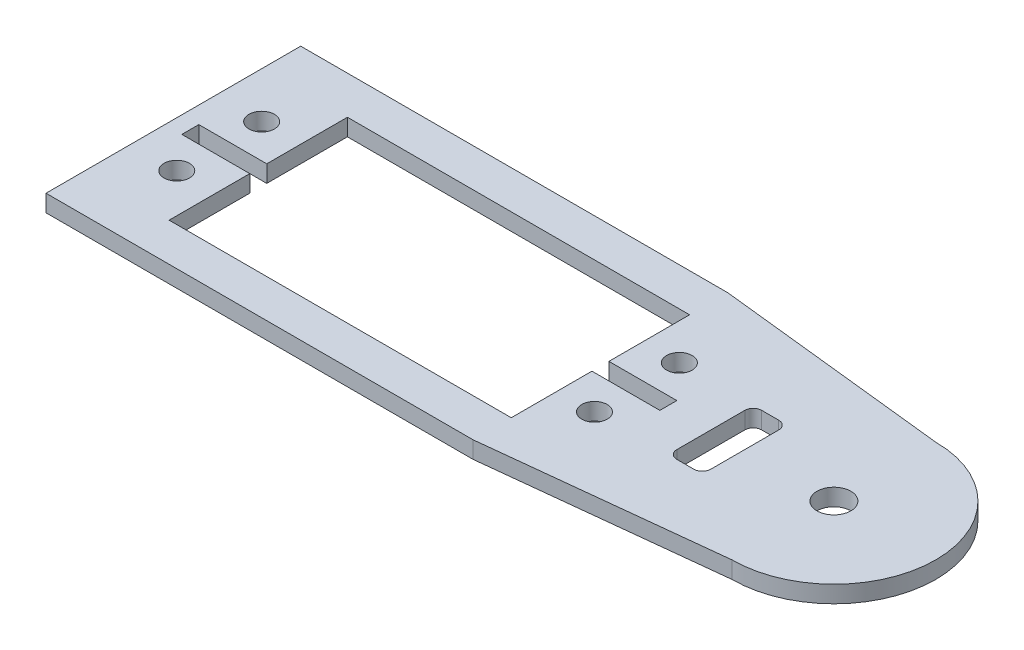
ISO-10303-21;
HEADER;
FILE_DESCRIPTION(('STEP AP214'),'2;1');
FILE_NAME('part.step','',(''),(''),'','','');
FILE_SCHEMA(('AUTOMOTIVE_DESIGN { 1 0 10303 214 1 1 1 1 }'));
ENDSEC;
DATA;
#1=APPLICATION_CONTEXT('core data for automotive mechanical design processes');
#2=APPLICATION_PROTOCOL_DEFINITION('international standard','automotive_design',2000,#1);
#3=PRODUCT_CONTEXT('',#1,'mechanical');
#4=PRODUCT('Part','Part','',(#3));
#5=PRODUCT_RELATED_PRODUCT_CATEGORY('part','',(#4));
#6=PRODUCT_DEFINITION_FORMATION('','',#4);
#7=PRODUCT_DEFINITION_CONTEXT('part definition',#1,'design');
#8=PRODUCT_DEFINITION('design','',#6,#7);
#9=PRODUCT_DEFINITION_SHAPE('','',#8);
#10=(LENGTH_UNIT() NAMED_UNIT(*) SI_UNIT(.MILLI.,.METRE.));
#11=(NAMED_UNIT(*) PLANE_ANGLE_UNIT() SI_UNIT($,.RADIAN.));
#12=(NAMED_UNIT(*) SI_UNIT($,.STERADIAN.) SOLID_ANGLE_UNIT());
#13=UNCERTAINTY_MEASURE_WITH_UNIT(LENGTH_MEASURE(1.E-05),#10,'distance_accuracy_value','');
#14=(GEOMETRIC_REPRESENTATION_CONTEXT(3) GLOBAL_UNCERTAINTY_ASSIGNED_CONTEXT((#13)) GLOBAL_UNIT_ASSIGNED_CONTEXT((#10,
#11,#12)) REPRESENTATION_CONTEXT('',''));
#15=CARTESIAN_POINT('',(0.,0.,0.));
#16=DIRECTION('',(0.,0.,1.));
#17=DIRECTION('',(1.,0.,0.));
#18=AXIS2_PLACEMENT_3D('',#15,#16,#17);
#19=CARTESIAN_POINT('',(75.8,2.,-15.));
#20=DIRECTION('',(0.,1.,0.));
#21=DIRECTION('',(0.,0.,1.));
#22=AXIS2_PLACEMENT_3D('',#19,#20,#21);
#23=PLANE('',#22);
#24=CARTESIAN_POINT('',(52.6,2.,-20.));
#25=DIRECTION('',(0.,1.,0.));
#26=DIRECTION('',(0.,0.,1.));
#27=AXIS2_PLACEMENT_3D('',#24,#25,#26);
#28=CIRCLE('',#27,1.5);
#29=CARTESIAN_POINT('',(52.6,2.,-18.5));
#30=VERTEX_POINT('',#29);
#31=EDGE_CURVE('E428',#30,#30,#28,.T.);
#32=ORIENTED_EDGE('',*,*,#31,.F.);
#33=EDGE_LOOP('',(#32));
#34=FACE_BOUND('',#33,.T.);
#35=CARTESIAN_POINT('',(3.4,2.,-20.));
#36=DIRECTION('',(0.,1.,0.));
#37=DIRECTION('',(0.,0.,1.));
#38=AXIS2_PLACEMENT_3D('',#35,#36,#37);
#39=CIRCLE('',#38,1.5);
#40=CARTESIAN_POINT('',(3.4,2.,-18.5));
#41=VERTEX_POINT('',#40);
#42=EDGE_CURVE('E440',#41,#41,#39,.T.);
#43=ORIENTED_EDGE('',*,*,#42,.F.);
#44=EDGE_LOOP('',(#43));
#45=FACE_BOUND('',#44,.T.);
#46=DIRECTION('',(-1.,0.,0.));
#47=VECTOR('',#46,1.);
#48=CARTESIAN_POINT('',(0.,2.,-16.));
#49=LINE('',#48,#47);
#50=CARTESIAN_POINT('',(8.,2.,-16.));
#51=VERTEX_POINT('',#50);
#52=CARTESIAN_POINT('',(0.,2.,-16.));
#53=VERTEX_POINT('',#52);
#54=EDGE_CURVE('E221',#51,#53,#49,.T.);
#55=ORIENTED_EDGE('',*,*,#54,.F.);
#56=DIRECTION('',(0.,0.,1.));
#57=VECTOR('',#56,1.);
#58=CARTESIAN_POINT('',(8.,2.,-16.));
#59=LINE('',#58,#57);
#60=CARTESIAN_POINT('',(8.,2.,-25.5));
#61=VERTEX_POINT('',#60);
#62=EDGE_CURVE('E211',#61,#51,#59,.T.);
#63=ORIENTED_EDGE('',*,*,#62,.F.);
#64=DIRECTION('',(-1.,0.,0.));
#65=VECTOR('',#64,1.);
#66=CARTESIAN_POINT('',(8.,2.,-25.5));
#67=LINE('',#66,#65);
#68=CARTESIAN_POINT('',(48.3,2.,-25.5));
#69=VERTEX_POINT('',#68);
#70=EDGE_CURVE('E257',#69,#61,#67,.T.);
#71=ORIENTED_EDGE('',*,*,#70,.F.);
#72=DIRECTION('',(0.,0.,-1.));
#73=VECTOR('',#72,1.);
#74=CARTESIAN_POINT('',(48.3,2.,-25.5));
#75=LINE('',#74,#73);
#76=CARTESIAN_POINT('',(48.3,2.,-16.));
#77=VERTEX_POINT('',#76);
#78=EDGE_CURVE('E254',#77,#69,#75,.T.);
#79=ORIENTED_EDGE('',*,*,#78,.F.);
#80=DIRECTION('',(-1.,0.,0.));
#81=VECTOR('',#80,1.);
#82=CARTESIAN_POINT('',(48.3,2.,-16.));
#83=LINE('',#82,#81);
#84=CARTESIAN_POINT('',(56.3,2.,-16.));
#85=VERTEX_POINT('',#84);
#86=EDGE_CURVE('E252',#85,#77,#83,.T.);
#87=ORIENTED_EDGE('',*,*,#86,.F.);
#88=DIRECTION('',(0.,0.,-1.));
#89=VECTOR('',#88,1.);
#90=CARTESIAN_POINT('',(56.3,2.,-14.));
#91=LINE('',#90,#89);
#92=CARTESIAN_POINT('',(56.3,2.,-14.));
#93=VERTEX_POINT('',#92);
#94=EDGE_CURVE('E250',#93,#85,#91,.T.);
#95=ORIENTED_EDGE('',*,*,#94,.F.);
#96=DIRECTION('',(1.,0.,0.));
#97=VECTOR('',#96,1.);
#98=CARTESIAN_POINT('',(48.3,2.,-14.));
#99=LINE('',#98,#97);
#100=CARTESIAN_POINT('',(48.3,2.,-14.));
#101=VERTEX_POINT('',#100);
#102=EDGE_CURVE('E248',#101,#93,#99,.T.);
#103=ORIENTED_EDGE('',*,*,#102,.F.);
#104=DIRECTION('',(0.,0.,-1.));
#105=VECTOR('',#104,1.);
#106=CARTESIAN_POINT('',(48.3,2.,-14.));
#107=LINE('',#106,#105);
#108=CARTESIAN_POINT('',(48.3,2.,-4.5));
#109=VERTEX_POINT('',#108);
#110=EDGE_CURVE('E246',#109,#101,#107,.T.);
#111=ORIENTED_EDGE('',*,*,#110,.F.);
#112=DIRECTION('',(1.,0.,0.));
#113=VECTOR('',#112,1.);
#114=CARTESIAN_POINT('',(8.,2.,-4.5));
#115=LINE('',#114,#113);
#116=CARTESIAN_POINT('',(8.,2.,-4.5));
#117=VERTEX_POINT('',#116);
#118=EDGE_CURVE('E244',#117,#109,#115,.T.);
#119=ORIENTED_EDGE('',*,*,#118,.F.);
#120=DIRECTION('',(0.,0.,1.));
#121=VECTOR('',#120,1.);
#122=CARTESIAN_POINT('',(8.,2.,-4.5));
#123=LINE('',#122,#121);
#124=CARTESIAN_POINT('',(8.,2.,-14.));
#125=VERTEX_POINT('',#124);
#126=EDGE_CURVE('E242',#125,#117,#123,.T.);
#127=ORIENTED_EDGE('',*,*,#126,.F.);
#128=DIRECTION('',(1.,0.,0.));
#129=VECTOR('',#128,1.);
#130=CARTESIAN_POINT('',(0.,2.,-14.));
#131=LINE('',#130,#129);
#132=CARTESIAN_POINT('',(0.,2.,-14.));
#133=VERTEX_POINT('',#132);
#134=EDGE_CURVE('E237',#133,#125,#131,.T.);
#135=ORIENTED_EDGE('',*,*,#134,.F.);
#136=DIRECTION('',(0.,0.,1.));
#137=VECTOR('',#136,1.);
#138=CARTESIAN_POINT('',(0.,2.,-14.));
#139=LINE('',#138,#137);
#140=EDGE_CURVE('E235',#53,#133,#139,.T.);
#141=ORIENTED_EDGE('',*,*,#140,.F.);
#142=EDGE_LOOP('',(#55,#63,#71,#79,#87,#95,#103,#111,#119,#127,#135,#141));
#143=FACE_BOUND('',#142,.T.);
#144=DIRECTION('',(-0.994102176607995,0.,-0.108447510175419));
#145=VECTOR('',#144,1.);
#146=CARTESIAN_POINT('',(48.3,2.,-30.));
#147=LINE('',#146,#145);
#148=CARTESIAN_POINT('',(75.8,2.,-27.));
#149=VERTEX_POINT('',#148);
#150=CARTESIAN_POINT('',(48.3,2.,-30.));
#151=VERTEX_POINT('',#150);
#152=EDGE_CURVE('E312',#149,#151,#147,.T.);
#153=ORIENTED_EDGE('',*,*,#152,.T.);
#154=DIRECTION('',(-1.,0.,0.));
#155=VECTOR('',#154,1.);
#156=CARTESIAN_POINT('',(-2.,2.,-30.));
#157=LINE('',#156,#155);
#158=CARTESIAN_POINT('',(-2.,2.,-30.));
#159=VERTEX_POINT('',#158);
#160=EDGE_CURVE('E315',#151,#159,#157,.T.);
#161=ORIENTED_EDGE('',*,*,#160,.T.);
#162=DIRECTION('',(0.,0.,1.));
#163=VECTOR('',#162,1.);
#164=CARTESIAN_POINT('',(-2.,2.,-30.));
#165=LINE('',#164,#163);
#166=CARTESIAN_POINT('',(-2.,2.,0.));
#167=VERTEX_POINT('',#166);
#168=EDGE_CURVE('E318',#159,#167,#165,.T.);
#169=ORIENTED_EDGE('',*,*,#168,.T.);
#170=DIRECTION('',(1.,0.,0.));
#171=VECTOR('',#170,1.);
#172=CARTESIAN_POINT('',(-2.,2.,0.));
#173=LINE('',#172,#171);
#174=CARTESIAN_POINT('',(48.3,2.,0.));
#175=VERTEX_POINT('',#174);
#176=EDGE_CURVE('E320',#167,#175,#173,.T.);
#177=ORIENTED_EDGE('',*,*,#176,.T.);
#178=DIRECTION('',(0.994102176607995,0.,-0.108447510175417));
#179=VECTOR('',#178,1.);
#180=CARTESIAN_POINT('',(48.3,2.,0.));
#181=LINE('',#180,#179);
#182=CARTESIAN_POINT('',(75.8,2.,-3.00000000000001));
#183=VERTEX_POINT('',#182);
#184=EDGE_CURVE('E322',#175,#183,#181,.T.);
#185=ORIENTED_EDGE('',*,*,#184,.T.);
#186=CARTESIAN_POINT('',(75.8,2.,-15.));
#187=DIRECTION('',(0.,1.,0.));
#188=DIRECTION('',(0.,0.,1.));
#189=AXIS2_PLACEMENT_3D('',#186,#187,#188);
#190=CIRCLE('',#189,12.);
#191=EDGE_CURVE('E324',#183,#149,#190,.T.);
#192=ORIENTED_EDGE('',*,*,#191,.T.);
#193=EDGE_LOOP('',(#153,#161,#169,#177,#185,#192));
#194=FACE_BOUND('',#193,.T.);
#195=CARTESIAN_POINT('',(3.4,2.,-10.));
#196=DIRECTION('',(0.,1.,0.));
#197=DIRECTION('',(0.,0.,1.));
#198=AXIS2_PLACEMENT_3D('',#195,#196,#197);
#199=CIRCLE('',#198,1.5);
#200=CARTESIAN_POINT('',(3.4,2.,-8.5));
#201=VERTEX_POINT('',#200);
#202=EDGE_CURVE('E261',#201,#201,#199,.T.);
#203=ORIENTED_EDGE('',*,*,#202,.F.);
#204=EDGE_LOOP('',(#203));
#205=FACE_BOUND('',#204,.T.);
#206=CARTESIAN_POINT('',(52.6,2.,-10.));
#207=DIRECTION('',(0.,1.,0.));
#208=DIRECTION('',(0.,0.,1.));
#209=AXIS2_PLACEMENT_3D('',#206,#207,#208);
#210=CIRCLE('',#209,1.5);
#211=CARTESIAN_POINT('',(52.6,2.,-8.49999999999999));
#212=VERTEX_POINT('',#211);
#213=EDGE_CURVE('E434',#212,#212,#210,.T.);
#214=ORIENTED_EDGE('',*,*,#213,.F.);
#215=EDGE_LOOP('',(#214));
#216=FACE_BOUND('',#215,.T.);
#217=CARTESIAN_POINT('',(75.8,2.,-15.));
#218=DIRECTION('',(0.,1.,0.));
#219=DIRECTION('',(0.,0.,1.));
#220=AXIS2_PLACEMENT_3D('',#217,#218,#219);
#221=CIRCLE('',#220,2.);
#222=CARTESIAN_POINT('',(75.8,2.,-13.));
#223=VERTEX_POINT('',#222);
#224=EDGE_CURVE('E422',#223,#223,#221,.T.);
#225=ORIENTED_EDGE('',*,*,#224,.F.);
#226=EDGE_LOOP('',(#225));
#227=FACE_BOUND('',#226,.T.);
#228=DIRECTION('',(-1.,0.,0.));
#229=VECTOR('',#228,1.);
#230=CARTESIAN_POINT('',(65.3,2.,-20.));
#231=LINE('',#230,#229);
#232=CARTESIAN_POINT('',(64.3,2.,-20.));
#233=VERTEX_POINT('',#232);
#234=CARTESIAN_POINT('',(62.3,2.,-20.));
#235=VERTEX_POINT('',#234);
#236=EDGE_CURVE('E403',#233,#235,#231,.T.);
#237=ORIENTED_EDGE('',*,*,#236,.F.);
#238=CARTESIAN_POINT('',(64.3,2.,-19.));
#239=DIRECTION('',(0.,1.,0.));
#240=DIRECTION('',(0.,0.,1.));
#241=AXIS2_PLACEMENT_3D('',#238,#239,#240);
#242=CIRCLE('',#241,1.);
#243=CARTESIAN_POINT('',(65.3,2.,-19.));
#244=VERTEX_POINT('',#243);
#245=EDGE_CURVE('E11',#233,#244,#242,.F.);
#246=ORIENTED_EDGE('',*,*,#245,.T.);
#247=DIRECTION('',(0.,0.,-1.));
#248=VECTOR('',#247,1.);
#249=CARTESIAN_POINT('',(65.3,2.,-20.));
#250=LINE('',#249,#248);
#251=CARTESIAN_POINT('',(65.3,2.,-11.));
#252=VERTEX_POINT('',#251);
#253=EDGE_CURVE('E401',#252,#244,#250,.T.);
#254=ORIENTED_EDGE('',*,*,#253,.F.);
#255=CARTESIAN_POINT('',(64.3,2.,-11.));
#256=DIRECTION('',(0.,1.,0.));
#257=DIRECTION('',(0.,0.,1.));
#258=AXIS2_PLACEMENT_3D('',#255,#256,#257);
#259=CIRCLE('',#258,1.);
#260=CARTESIAN_POINT('',(64.3,2.,-10.));
#261=VERTEX_POINT('',#260);
#262=EDGE_CURVE('E380',#252,#261,#259,.F.);
#263=ORIENTED_EDGE('',*,*,#262,.T.);
#264=DIRECTION('',(1.,0.,0.));
#265=VECTOR('',#264,1.);
#266=CARTESIAN_POINT('',(65.3,2.,-10.));
#267=LINE('',#266,#265);
#268=CARTESIAN_POINT('',(62.3,2.,-10.));
#269=VERTEX_POINT('',#268);
#270=EDGE_CURVE('E415',#269,#261,#267,.T.);
#271=ORIENTED_EDGE('',*,*,#270,.F.);
#272=CARTESIAN_POINT('',(62.3,2.,-11.));
#273=DIRECTION('',(0.,1.,0.));
#274=DIRECTION('',(0.,0.,1.));
#275=AXIS2_PLACEMENT_3D('',#272,#273,#274);
#276=CIRCLE('',#275,1.);
#277=CARTESIAN_POINT('',(61.3,2.,-11.));
#278=VERTEX_POINT('',#277);
#279=EDGE_CURVE('E376',#269,#278,#276,.F.);
#280=ORIENTED_EDGE('',*,*,#279,.T.);
#281=DIRECTION('',(0.,0.,1.));
#282=VECTOR('',#281,1.);
#283=CARTESIAN_POINT('',(61.3,2.,-20.));
#284=LINE('',#283,#282);
#285=CARTESIAN_POINT('',(61.3,2.,-19.));
#286=VERTEX_POINT('',#285);
#287=EDGE_CURVE('E409',#286,#278,#284,.T.);
#288=ORIENTED_EDGE('',*,*,#287,.F.);
#289=CARTESIAN_POINT('',(62.3,2.,-19.));
#290=DIRECTION('',(0.,1.,0.));
#291=DIRECTION('',(0.,0.,1.));
#292=AXIS2_PLACEMENT_3D('',#289,#290,#291);
#293=CIRCLE('',#292,1.);
#294=EDGE_CURVE('E51',#286,#235,#293,.F.);
#295=ORIENTED_EDGE('',*,*,#294,.T.);
#296=EDGE_LOOP('',(#237,#246,#254,#263,#271,#280,#288,#295));
#297=FACE_BOUND('',#296,.T.);
#298=ADVANCED_FACE('F36',(#34,#45,#143,#194,#205,#216,#227,#297),#23,.T.);
#299=CARTESIAN_POINT('',(75.8,0.,-15.));
#300=DIRECTION('',(0.,1.,0.));
#301=DIRECTION('',(0.,0.,1.));
#302=AXIS2_PLACEMENT_3D('',#299,#300,#301);
#303=PLANE('',#302);
#304=CARTESIAN_POINT('',(75.8,0.,-15.));
#305=DIRECTION('',(0.,1.,0.));
#306=DIRECTION('',(0.,0.,1.));
#307=AXIS2_PLACEMENT_3D('',#304,#305,#306);
#308=CIRCLE('',#307,2.);
#309=CARTESIAN_POINT('',(75.8,0.,-13.));
#310=VERTEX_POINT('',#309);
#311=EDGE_CURVE('E418',#310,#310,#308,.T.);
#312=ORIENTED_EDGE('',*,*,#311,.T.);
#313=EDGE_LOOP('',(#312));
#314=FACE_BOUND('',#313,.T.);
#315=CARTESIAN_POINT('',(52.6,0.,-20.));
#316=DIRECTION('',(0.,1.,0.));
#317=DIRECTION('',(0.,0.,1.));
#318=AXIS2_PLACEMENT_3D('',#315,#316,#317);
#319=CIRCLE('',#318,1.5);
#320=CARTESIAN_POINT('',(52.6,0.,-18.5));
#321=VERTEX_POINT('',#320);
#322=EDGE_CURVE('E425',#321,#321,#319,.T.);
#323=ORIENTED_EDGE('',*,*,#322,.T.);
#324=EDGE_LOOP('',(#323));
#325=FACE_BOUND('',#324,.T.);
#326=CARTESIAN_POINT('',(52.6,0.,-10.));
#327=DIRECTION('',(0.,1.,0.));
#328=DIRECTION('',(0.,0.,1.));
#329=AXIS2_PLACEMENT_3D('',#326,#327,#328);
#330=CIRCLE('',#329,1.5);
#331=CARTESIAN_POINT('',(52.6,0.,-8.49999999999999));
#332=VERTEX_POINT('',#331);
#333=EDGE_CURVE('E431',#332,#332,#330,.T.);
#334=ORIENTED_EDGE('',*,*,#333,.T.);
#335=EDGE_LOOP('',(#334));
#336=FACE_BOUND('',#335,.T.);
#337=CARTESIAN_POINT('',(3.4,0.,-20.));
#338=DIRECTION('',(0.,1.,0.));
#339=DIRECTION('',(0.,0.,1.));
#340=AXIS2_PLACEMENT_3D('',#337,#338,#339);
#341=CIRCLE('',#340,1.5);
#342=CARTESIAN_POINT('',(3.4,0.,-18.5));
#343=VERTEX_POINT('',#342);
#344=EDGE_CURVE('E437',#343,#343,#341,.T.);
#345=ORIENTED_EDGE('',*,*,#344,.T.);
#346=EDGE_LOOP('',(#345));
#347=FACE_BOUND('',#346,.T.);
#348=CARTESIAN_POINT('',(3.4,0.,-10.));
#349=DIRECTION('',(0.,1.,0.));
#350=DIRECTION('',(0.,0.,1.));
#351=AXIS2_PLACEMENT_3D('',#348,#349,#350);
#352=CIRCLE('',#351,1.5);
#353=CARTESIAN_POINT('',(3.4,0.,-8.5));
#354=VERTEX_POINT('',#353);
#355=EDGE_CURVE('E443',#354,#354,#352,.T.);
#356=ORIENTED_EDGE('',*,*,#355,.T.);
#357=EDGE_LOOP('',(#356));
#358=FACE_BOUND('',#357,.T.);
#359=DIRECTION('',(0.,0.,1.));
#360=VECTOR('',#359,1.);
#361=CARTESIAN_POINT('',(8.,0.,-16.));
#362=LINE('',#361,#360);
#363=CARTESIAN_POINT('',(8.00000000000001,0.,-25.5));
#364=VERTEX_POINT('',#363);
#365=CARTESIAN_POINT('',(8.,0.,-16.));
#366=VERTEX_POINT('',#365);
#367=EDGE_CURVE('E259',#364,#366,#362,.T.);
#368=ORIENTED_EDGE('',*,*,#367,.T.);
#369=DIRECTION('',(-1.,0.,0.));
#370=VECTOR('',#369,1.);
#371=CARTESIAN_POINT('',(0.,0.,-16.));
#372=LINE('',#371,#370);
#373=CARTESIAN_POINT('',(0.,0.,-16.));
#374=VERTEX_POINT('',#373);
#375=EDGE_CURVE('E228',#366,#374,#372,.T.);
#376=ORIENTED_EDGE('',*,*,#375,.T.);
#377=DIRECTION('',(0.,0.,1.));
#378=VECTOR('',#377,1.);
#379=CARTESIAN_POINT('',(0.,0.,-14.));
#380=LINE('',#379,#378);
#381=CARTESIAN_POINT('',(0.,0.,-14.));
#382=VERTEX_POINT('',#381);
#383=EDGE_CURVE('E263',#374,#382,#380,.T.);
#384=ORIENTED_EDGE('',*,*,#383,.T.);
#385=DIRECTION('',(1.,0.,0.));
#386=VECTOR('',#385,1.);
#387=CARTESIAN_POINT('',(0.,0.,-14.));
#388=LINE('',#387,#386);
#389=CARTESIAN_POINT('',(8.,0.,-14.));
#390=VERTEX_POINT('',#389);
#391=EDGE_CURVE('E266',#382,#390,#388,.T.);
#392=ORIENTED_EDGE('',*,*,#391,.T.);
#393=DIRECTION('',(0.,0.,1.));
#394=VECTOR('',#393,1.);
#395=CARTESIAN_POINT('',(8.,0.,-4.5));
#396=LINE('',#395,#394);
#397=CARTESIAN_POINT('',(8.,0.,-4.5));
#398=VERTEX_POINT('',#397);
#399=EDGE_CURVE('E269',#390,#398,#396,.T.);
#400=ORIENTED_EDGE('',*,*,#399,.T.);
#401=DIRECTION('',(1.,0.,0.));
#402=VECTOR('',#401,1.);
#403=CARTESIAN_POINT('',(8.,0.,-4.5));
#404=LINE('',#403,#402);
#405=CARTESIAN_POINT('',(48.3,0.,-4.5));
#406=VERTEX_POINT('',#405);
#407=EDGE_CURVE('E272',#398,#406,#404,.T.);
#408=ORIENTED_EDGE('',*,*,#407,.T.);
#409=DIRECTION('',(0.,0.,-1.));
#410=VECTOR('',#409,1.);
#411=CARTESIAN_POINT('',(48.3,0.,-14.));
#412=LINE('',#411,#410);
#413=CARTESIAN_POINT('',(48.3,0.,-14.));
#414=VERTEX_POINT('',#413);
#415=EDGE_CURVE('E275',#406,#414,#412,.T.);
#416=ORIENTED_EDGE('',*,*,#415,.T.);
#417=DIRECTION('',(1.,0.,0.));
#418=VECTOR('',#417,1.);
#419=CARTESIAN_POINT('',(48.3,0.,-14.));
#420=LINE('',#419,#418);
#421=CARTESIAN_POINT('',(56.3,0.,-14.));
#422=VERTEX_POINT('',#421);
#423=EDGE_CURVE('E278',#414,#422,#420,.T.);
#424=ORIENTED_EDGE('',*,*,#423,.T.);
#425=DIRECTION('',(0.,0.,-1.));
#426=VECTOR('',#425,1.);
#427=CARTESIAN_POINT('',(56.3,0.,-14.));
#428=LINE('',#427,#426);
#429=CARTESIAN_POINT('',(56.3,0.,-16.));
#430=VERTEX_POINT('',#429);
#431=EDGE_CURVE('E281',#422,#430,#428,.T.);
#432=ORIENTED_EDGE('',*,*,#431,.T.);
#433=DIRECTION('',(-1.,0.,0.));
#434=VECTOR('',#433,1.);
#435=CARTESIAN_POINT('',(48.3,0.,-16.));
#436=LINE('',#435,#434);
#437=CARTESIAN_POINT('',(48.3,0.,-16.));
#438=VERTEX_POINT('',#437);
#439=EDGE_CURVE('E284',#430,#438,#436,.T.);
#440=ORIENTED_EDGE('',*,*,#439,.T.);
#441=DIRECTION('',(0.,0.,-1.));
#442=VECTOR('',#441,1.);
#443=CARTESIAN_POINT('',(48.3,0.,-25.5));
#444=LINE('',#443,#442);
#445=CARTESIAN_POINT('',(48.3,0.,-25.5));
#446=VERTEX_POINT('',#445);
#447=EDGE_CURVE('E287',#438,#446,#444,.T.);
#448=ORIENTED_EDGE('',*,*,#447,.T.);
#449=DIRECTION('',(-1.,0.,0.));
#450=VECTOR('',#449,1.);
#451=CARTESIAN_POINT('',(8.,0.,-25.5));
#452=LINE('',#451,#450);
#453=EDGE_CURVE('E222',#446,#364,#452,.T.);
#454=ORIENTED_EDGE('',*,*,#453,.T.);
#455=EDGE_LOOP('',(#368,#376,#384,#392,#400,#408,#416,#424,#432,#440,#448,#454));
#456=FACE_BOUND('',#455,.T.);
#457=DIRECTION('',(-0.994102176607995,0.,-0.108447510175419));
#458=VECTOR('',#457,1.);
#459=CARTESIAN_POINT('',(48.3,0.,-30.));
#460=LINE('',#459,#458);
#461=CARTESIAN_POINT('',(75.8,0.,-27.));
#462=VERTEX_POINT('',#461);
#463=CARTESIAN_POINT('',(48.3,0.,-30.));
#464=VERTEX_POINT('',#463);
#465=EDGE_CURVE('E229',#462,#464,#460,.T.);
#466=ORIENTED_EDGE('',*,*,#465,.F.);
#467=CARTESIAN_POINT('',(75.8,0.,-15.));
#468=DIRECTION('',(0.,1.,0.));
#469=DIRECTION('',(0.,0.,1.));
#470=AXIS2_PLACEMENT_3D('',#467,#468,#469);
#471=CIRCLE('',#470,12.);
#472=CARTESIAN_POINT('',(75.8,0.,-3.00000000000001));
#473=VERTEX_POINT('',#472);
#474=EDGE_CURVE('E316',#473,#462,#471,.T.);
#475=ORIENTED_EDGE('',*,*,#474,.F.);
#476=DIRECTION('',(0.994102176607995,0.,-0.108447510175417));
#477=VECTOR('',#476,1.);
#478=CARTESIAN_POINT('',(48.3,0.,0.));
#479=LINE('',#478,#477);
#480=CARTESIAN_POINT('',(48.3,0.,0.));
#481=VERTEX_POINT('',#480);
#482=EDGE_CURVE('E335',#481,#473,#479,.T.);
#483=ORIENTED_EDGE('',*,*,#482,.F.);
#484=DIRECTION('',(1.,0.,0.));
#485=VECTOR('',#484,1.);
#486=CARTESIAN_POINT('',(-2.,0.,0.));
#487=LINE('',#486,#485);
#488=CARTESIAN_POINT('',(-2.,0.,0.));
#489=VERTEX_POINT('',#488);
#490=EDGE_CURVE('E333',#489,#481,#487,.T.);
#491=ORIENTED_EDGE('',*,*,#490,.F.);
#492=DIRECTION('',(0.,0.,1.));
#493=VECTOR('',#492,1.);
#494=CARTESIAN_POINT('',(-2.,0.,-30.));
#495=LINE('',#494,#493);
#496=CARTESIAN_POINT('',(-2.,0.,-30.));
#497=VERTEX_POINT('',#496);
#498=EDGE_CURVE('E331',#497,#489,#495,.T.);
#499=ORIENTED_EDGE('',*,*,#498,.F.);
#500=DIRECTION('',(-1.,0.,0.));
#501=VECTOR('',#500,1.);
#502=CARTESIAN_POINT('',(-2.,0.,-30.));
#503=LINE('',#502,#501);
#504=EDGE_CURVE('E329',#464,#497,#503,.T.);
#505=ORIENTED_EDGE('',*,*,#504,.F.);
#506=EDGE_LOOP('',(#466,#475,#483,#491,#499,#505));
#507=FACE_BOUND('',#506,.T.);
#508=DIRECTION('',(1.,0.,0.));
#509=VECTOR('',#508,1.);
#510=CARTESIAN_POINT('',(65.3,0.,-10.));
#511=LINE('',#510,#509);
#512=CARTESIAN_POINT('',(62.3,0.,-10.));
#513=VERTEX_POINT('',#512);
#514=CARTESIAN_POINT('',(64.3,0.,-10.));
#515=VERTEX_POINT('',#514);
#516=EDGE_CURVE('E407',#513,#515,#511,.T.);
#517=ORIENTED_EDGE('',*,*,#516,.T.);
#518=CARTESIAN_POINT('',(64.3,0.,-11.));
#519=DIRECTION('',(0.,1.,0.));
#520=DIRECTION('',(0.,0.,1.));
#521=AXIS2_PLACEMENT_3D('',#518,#519,#520);
#522=CIRCLE('',#521,1.);
#523=CARTESIAN_POINT('',(65.3,0.,-11.));
#524=VERTEX_POINT('',#523);
#525=EDGE_CURVE('E378',#515,#524,#522,.T.);
#526=ORIENTED_EDGE('',*,*,#525,.T.);
#527=DIRECTION('',(0.,0.,-1.));
#528=VECTOR('',#527,1.);
#529=CARTESIAN_POINT('',(65.3,0.,-20.));
#530=LINE('',#529,#528);
#531=CARTESIAN_POINT('',(65.3,0.,-19.));
#532=VERTEX_POINT('',#531);
#533=EDGE_CURVE('E391',#524,#532,#530,.T.);
#534=ORIENTED_EDGE('',*,*,#533,.T.);
#535=CARTESIAN_POINT('',(64.3,0.,-19.));
#536=DIRECTION('',(0.,1.,0.));
#537=DIRECTION('',(0.,0.,1.));
#538=AXIS2_PLACEMENT_3D('',#535,#536,#537);
#539=CIRCLE('',#538,1.);
#540=CARTESIAN_POINT('',(64.3,0.,-20.));
#541=VERTEX_POINT('',#540);
#542=EDGE_CURVE('E44',#532,#541,#539,.T.);
#543=ORIENTED_EDGE('',*,*,#542,.T.);
#544=DIRECTION('',(-1.,0.,0.));
#545=VECTOR('',#544,1.);
#546=CARTESIAN_POINT('',(65.3,0.,-20.));
#547=LINE('',#546,#545);
#548=CARTESIAN_POINT('',(62.3,0.,-20.));
#549=VERTEX_POINT('',#548);
#550=EDGE_CURVE('E389',#541,#549,#547,.T.);
#551=ORIENTED_EDGE('',*,*,#550,.T.);
#552=CARTESIAN_POINT('',(62.3,0.,-19.));
#553=DIRECTION('',(0.,1.,0.));
#554=DIRECTION('',(0.,0.,1.));
#555=AXIS2_PLACEMENT_3D('',#552,#553,#554);
#556=CIRCLE('',#555,1.);
#557=CARTESIAN_POINT('',(61.3,0.,-19.));
#558=VERTEX_POINT('',#557);
#559=EDGE_CURVE('E382',#549,#558,#556,.T.);
#560=ORIENTED_EDGE('',*,*,#559,.T.);
#561=DIRECTION('',(0.,0.,1.));
#562=VECTOR('',#561,1.);
#563=CARTESIAN_POINT('',(61.3,0.,-20.));
#564=LINE('',#563,#562);
#565=CARTESIAN_POINT('',(61.3,0.,-11.));
#566=VERTEX_POINT('',#565);
#567=EDGE_CURVE('E396',#558,#566,#564,.T.);
#568=ORIENTED_EDGE('',*,*,#567,.T.);
#569=CARTESIAN_POINT('',(62.3,0.,-11.));
#570=DIRECTION('',(0.,1.,0.));
#571=DIRECTION('',(0.,0.,1.));
#572=AXIS2_PLACEMENT_3D('',#569,#570,#571);
#573=CIRCLE('',#572,1.);
#574=EDGE_CURVE('E374',#566,#513,#573,.T.);
#575=ORIENTED_EDGE('',*,*,#574,.T.);
#576=EDGE_LOOP('',(#517,#526,#534,#543,#551,#560,#568,#575));
#577=FACE_BOUND('',#576,.T.);
#578=ADVANCED_FACE('F388',(#314,#325,#336,#347,#358,#456,#507,#577),#303,.F.);
#579=CARTESIAN_POINT('',(48.3,2.,-30.));
#580=DIRECTION('',(-0.108447510175419,0.,0.994102176607995));
#581=DIRECTION('',(0.994102176607995,0.,0.108447510175419));
#582=AXIS2_PLACEMENT_3D('',#579,#580,#581);
#583=PLANE('',#582);
#584=ORIENTED_EDGE('',*,*,#465,.T.);
#585=DIRECTION('',(0.,-1.,0.));
#586=VECTOR('',#585,1.);
#587=CARTESIAN_POINT('',(48.3,2.,-30.));
#588=LINE('',#587,#586);
#589=EDGE_CURVE('E352',#151,#464,#588,.T.);
#590=ORIENTED_EDGE('',*,*,#589,.F.);
#591=ORIENTED_EDGE('',*,*,#152,.F.);
#592=DIRECTION('',(0.,-1.,0.));
#593=VECTOR('',#592,1.);
#594=CARTESIAN_POINT('',(75.8,2.,-27.));
#595=LINE('',#594,#593);
#596=EDGE_CURVE('E326',#149,#462,#595,.T.);
#597=ORIENTED_EDGE('',*,*,#596,.T.);
#598=EDGE_LOOP('',(#584,#590,#591,#597));
#599=FACE_BOUND('',#598,.T.);
#600=ADVANCED_FACE('F474',(#599),#583,.F.);
#601=CARTESIAN_POINT('',(-2.,2.,-30.));
#602=DIRECTION('',(0.,0.,1.));
#603=DIRECTION('',(1.,0.,0.));
#604=AXIS2_PLACEMENT_3D('',#601,#602,#603);
#605=PLANE('',#604);
#606=ORIENTED_EDGE('',*,*,#504,.T.);
#607=DIRECTION('',(0.,-1.,0.));
#608=VECTOR('',#607,1.);
#609=CARTESIAN_POINT('',(-2.,2.,-30.));
#610=LINE('',#609,#608);
#611=EDGE_CURVE('E349',#159,#497,#610,.T.);
#612=ORIENTED_EDGE('',*,*,#611,.F.);
#613=ORIENTED_EDGE('',*,*,#160,.F.);
#614=ORIENTED_EDGE('',*,*,#589,.T.);
#615=EDGE_LOOP('',(#606,#612,#613,#614));
#616=FACE_BOUND('',#615,.T.);
#617=ADVANCED_FACE('F497',(#616),#605,.F.);
#618=CARTESIAN_POINT('',(-2.,2.,-30.));
#619=DIRECTION('',(1.,0.,0.));
#620=DIRECTION('',(0.,0.,-1.));
#621=AXIS2_PLACEMENT_3D('',#618,#619,#620);
#622=PLANE('',#621);
#623=ORIENTED_EDGE('',*,*,#498,.T.);
#624=DIRECTION('',(0.,-1.,0.));
#625=VECTOR('',#624,1.);
#626=CARTESIAN_POINT('',(-2.,2.,0.));
#627=LINE('',#626,#625);
#628=EDGE_CURVE('E346',#167,#489,#627,.T.);
#629=ORIENTED_EDGE('',*,*,#628,.F.);
#630=ORIENTED_EDGE('',*,*,#168,.F.);
#631=ORIENTED_EDGE('',*,*,#611,.T.);
#632=EDGE_LOOP('',(#623,#629,#630,#631));
#633=FACE_BOUND('',#632,.T.);
#634=ADVANCED_FACE('F493',(#633),#622,.F.);
#635=CARTESIAN_POINT('',(-2.,2.,0.));
#636=DIRECTION('',(0.,0.,-1.));
#637=DIRECTION('',(-1.,0.,0.));
#638=AXIS2_PLACEMENT_3D('',#635,#636,#637);
#639=PLANE('',#638);
#640=ORIENTED_EDGE('',*,*,#490,.T.);
#641=DIRECTION('',(0.,-1.,0.));
#642=VECTOR('',#641,1.);
#643=CARTESIAN_POINT('',(48.3,2.,0.));
#644=LINE('',#643,#642);
#645=EDGE_CURVE('E343',#175,#481,#644,.T.);
#646=ORIENTED_EDGE('',*,*,#645,.F.);
#647=ORIENTED_EDGE('',*,*,#176,.F.);
#648=ORIENTED_EDGE('',*,*,#628,.T.);
#649=EDGE_LOOP('',(#640,#646,#647,#648));
#650=FACE_BOUND('',#649,.T.);
#651=ADVANCED_FACE('F489',(#650),#639,.F.);
#652=CARTESIAN_POINT('',(48.3,2.,0.));
#653=DIRECTION('',(-0.108447510175417,0.,-0.994102176607995));
#654=DIRECTION('',(-0.994102176607995,0.,0.108447510175417));
#655=AXIS2_PLACEMENT_3D('',#652,#653,#654);
#656=PLANE('',#655);
#657=ORIENTED_EDGE('',*,*,#482,.T.);
#658=DIRECTION('',(0.,-1.,0.));
#659=VECTOR('',#658,1.);
#660=CARTESIAN_POINT('',(75.8,2.,-3.00000000000001));
#661=LINE('',#660,#659);
#662=EDGE_CURVE('E340',#183,#473,#661,.T.);
#663=ORIENTED_EDGE('',*,*,#662,.F.);
#664=ORIENTED_EDGE('',*,*,#184,.F.);
#665=ORIENTED_EDGE('',*,*,#645,.T.);
#666=EDGE_LOOP('',(#657,#663,#664,#665));
#667=FACE_BOUND('',#666,.T.);
#668=ADVANCED_FACE('F485',(#667),#656,.F.);
#669=CARTESIAN_POINT('',(75.8,2.,-15.));
#670=DIRECTION('',(0.,-1.,0.));
#671=DIRECTION('',(0.,0.,-1.));
#672=AXIS2_PLACEMENT_3D('',#669,#670,#671);
#673=CYLINDRICAL_SURFACE('',#672,12.);
#674=ORIENTED_EDGE('',*,*,#474,.T.);
#675=ORIENTED_EDGE('',*,*,#596,.F.);
#676=ORIENTED_EDGE('',*,*,#191,.F.);
#677=ORIENTED_EDGE('',*,*,#662,.T.);
#678=EDGE_LOOP('',(#674,#675,#676,#677));
#679=FACE_BOUND('',#678,.T.);
#680=ADVANCED_FACE('F482',(#679),#673,.T.);
#681=CARTESIAN_POINT('',(8.,2.,-16.));
#682=DIRECTION('',(1.,0.,0.));
#683=DIRECTION('',(0.,0.,-1.));
#684=AXIS2_PLACEMENT_3D('',#681,#682,#683);
#685=PLANE('',#684);
#686=ORIENTED_EDGE('',*,*,#367,.F.);
#687=DIRECTION('',(0.,-1.,0.));
#688=VECTOR('',#687,1.);
#689=CARTESIAN_POINT('',(8.,2.,-25.5));
#690=LINE('',#689,#688);
#691=EDGE_CURVE('E217',#61,#364,#690,.T.);
#692=ORIENTED_EDGE('',*,*,#691,.F.);
#693=ORIENTED_EDGE('',*,*,#62,.T.);
#694=DIRECTION('',(0.,-1.,0.));
#695=VECTOR('',#694,1.);
#696=CARTESIAN_POINT('',(8.,2.,-16.));
#697=LINE('',#696,#695);
#698=EDGE_CURVE('E214',#51,#366,#697,.T.);
#699=ORIENTED_EDGE('',*,*,#698,.T.);
#700=EDGE_LOOP('',(#686,#692,#693,#699));
#701=FACE_BOUND('',#700,.T.);
#702=ADVANCED_FACE('F213',(#701),#685,.T.);
#703=CARTESIAN_POINT('',(0.,2.,-16.));
#704=DIRECTION('',(0.,0.,1.));
#705=DIRECTION('',(1.,0.,0.));
#706=AXIS2_PLACEMENT_3D('',#703,#704,#705);
#707=PLANE('',#706);
#708=ORIENTED_EDGE('',*,*,#375,.F.);
#709=ORIENTED_EDGE('',*,*,#698,.F.);
#710=ORIENTED_EDGE('',*,*,#54,.T.);
#711=DIRECTION('',(0.,-1.,0.));
#712=VECTOR('',#711,1.);
#713=CARTESIAN_POINT('',(0.,2.,-16.));
#714=LINE('',#713,#712);
#715=EDGE_CURVE('E230',#53,#374,#714,.T.);
#716=ORIENTED_EDGE('',*,*,#715,.T.);
#717=EDGE_LOOP('',(#708,#709,#710,#716));
#718=FACE_BOUND('',#717,.T.);
#719=ADVANCED_FACE('F225',(#718),#707,.T.);
#720=CARTESIAN_POINT('',(0.,2.,-14.));
#721=DIRECTION('',(1.,0.,0.));
#722=DIRECTION('',(0.,0.,-1.));
#723=AXIS2_PLACEMENT_3D('',#720,#721,#722);
#724=PLANE('',#723);
#725=ORIENTED_EDGE('',*,*,#383,.F.);
#726=ORIENTED_EDGE('',*,*,#715,.F.);
#727=ORIENTED_EDGE('',*,*,#140,.T.);
#728=DIRECTION('',(0.,-1.,0.));
#729=VECTOR('',#728,1.);
#730=CARTESIAN_POINT('',(0.,2.,-14.));
#731=LINE('',#730,#729);
#732=EDGE_CURVE('E309',#133,#382,#731,.T.);
#733=ORIENTED_EDGE('',*,*,#732,.T.);
#734=EDGE_LOOP('',(#725,#726,#727,#733));
#735=FACE_BOUND('',#734,.T.);
#736=ADVANCED_FACE('F713',(#735),#724,.T.);
#737=CARTESIAN_POINT('',(0.,2.,-14.));
#738=DIRECTION('',(0.,0.,-1.));
#739=DIRECTION('',(-1.,0.,0.));
#740=AXIS2_PLACEMENT_3D('',#737,#738,#739);
#741=PLANE('',#740);
#742=ORIENTED_EDGE('',*,*,#391,.F.);
#743=ORIENTED_EDGE('',*,*,#732,.F.);
#744=ORIENTED_EDGE('',*,*,#134,.T.);
#745=DIRECTION('',(0.,-1.,0.));
#746=VECTOR('',#745,1.);
#747=CARTESIAN_POINT('',(8.,2.,-14.));
#748=LINE('',#747,#746);
#749=EDGE_CURVE('E307',#125,#390,#748,.T.);
#750=ORIENTED_EDGE('',*,*,#749,.T.);
#751=EDGE_LOOP('',(#742,#743,#744,#750));
#752=FACE_BOUND('',#751,.T.);
#753=ADVANCED_FACE('F704',(#752),#741,.T.);
#754=CARTESIAN_POINT('',(8.,2.,-4.5));
#755=DIRECTION('',(1.,0.,0.));
#756=DIRECTION('',(0.,0.,-1.));
#757=AXIS2_PLACEMENT_3D('',#754,#755,#756);
#758=PLANE('',#757);
#759=ORIENTED_EDGE('',*,*,#399,.F.);
#760=ORIENTED_EDGE('',*,*,#749,.F.);
#761=ORIENTED_EDGE('',*,*,#126,.T.);
#762=DIRECTION('',(0.,-1.,0.));
#763=VECTOR('',#762,1.);
#764=CARTESIAN_POINT('',(8.,2.,-4.5));
#765=LINE('',#764,#763);
#766=EDGE_CURVE('E305',#117,#398,#765,.T.);
#767=ORIENTED_EDGE('',*,*,#766,.T.);
#768=EDGE_LOOP('',(#759,#760,#761,#767));
#769=FACE_BOUND('',#768,.T.);
#770=ADVANCED_FACE('F695',(#769),#758,.T.);
#771=CARTESIAN_POINT('',(8.,2.,-4.5));
#772=DIRECTION('',(0.,0.,-1.));
#773=DIRECTION('',(-1.,0.,0.));
#774=AXIS2_PLACEMENT_3D('',#771,#772,#773);
#775=PLANE('',#774);
#776=ORIENTED_EDGE('',*,*,#407,.F.);
#777=ORIENTED_EDGE('',*,*,#766,.F.);
#778=ORIENTED_EDGE('',*,*,#118,.T.);
#779=DIRECTION('',(0.,-1.,0.));
#780=VECTOR('',#779,1.);
#781=CARTESIAN_POINT('',(48.3,2.,-4.5));
#782=LINE('',#781,#780);
#783=EDGE_CURVE('E303',#109,#406,#782,.T.);
#784=ORIENTED_EDGE('',*,*,#783,.T.);
#785=EDGE_LOOP('',(#776,#777,#778,#784));
#786=FACE_BOUND('',#785,.T.);
#787=ADVANCED_FACE('F686',(#786),#775,.T.);
#788=CARTESIAN_POINT('',(48.3,2.,-14.));
#789=DIRECTION('',(-1.,0.,0.));
#790=DIRECTION('',(0.,0.,1.));
#791=AXIS2_PLACEMENT_3D('',#788,#789,#790);
#792=PLANE('',#791);
#793=ORIENTED_EDGE('',*,*,#415,.F.);
#794=ORIENTED_EDGE('',*,*,#783,.F.);
#795=ORIENTED_EDGE('',*,*,#110,.T.);
#796=DIRECTION('',(0.,-1.,0.));
#797=VECTOR('',#796,1.);
#798=CARTESIAN_POINT('',(48.3,2.,-14.));
#799=LINE('',#798,#797);
#800=EDGE_CURVE('E301',#101,#414,#799,.T.);
#801=ORIENTED_EDGE('',*,*,#800,.T.);
#802=EDGE_LOOP('',(#793,#794,#795,#801));
#803=FACE_BOUND('',#802,.T.);
#804=ADVANCED_FACE('F677',(#803),#792,.T.);
#805=CARTESIAN_POINT('',(48.3,2.,-14.));
#806=DIRECTION('',(0.,0.,-1.));
#807=DIRECTION('',(-1.,0.,0.));
#808=AXIS2_PLACEMENT_3D('',#805,#806,#807);
#809=PLANE('',#808);
#810=ORIENTED_EDGE('',*,*,#423,.F.);
#811=ORIENTED_EDGE('',*,*,#800,.F.);
#812=ORIENTED_EDGE('',*,*,#102,.T.);
#813=DIRECTION('',(0.,-1.,0.));
#814=VECTOR('',#813,1.);
#815=CARTESIAN_POINT('',(56.3,2.,-14.));
#816=LINE('',#815,#814);
#817=EDGE_CURVE('E299',#93,#422,#816,.T.);
#818=ORIENTED_EDGE('',*,*,#817,.T.);
#819=EDGE_LOOP('',(#810,#811,#812,#818));
#820=FACE_BOUND('',#819,.T.);
#821=ADVANCED_FACE('F668',(#820),#809,.T.);
#822=CARTESIAN_POINT('',(56.3,2.,-14.));
#823=DIRECTION('',(-1.,0.,0.));
#824=DIRECTION('',(0.,0.,1.));
#825=AXIS2_PLACEMENT_3D('',#822,#823,#824);
#826=PLANE('',#825);
#827=ORIENTED_EDGE('',*,*,#431,.F.);
#828=ORIENTED_EDGE('',*,*,#817,.F.);
#829=ORIENTED_EDGE('',*,*,#94,.T.);
#830=DIRECTION('',(0.,-1.,0.));
#831=VECTOR('',#830,1.);
#832=CARTESIAN_POINT('',(56.3,2.,-16.));
#833=LINE('',#832,#831);
#834=EDGE_CURVE('E297',#85,#430,#833,.T.);
#835=ORIENTED_EDGE('',*,*,#834,.T.);
#836=EDGE_LOOP('',(#827,#828,#829,#835));
#837=FACE_BOUND('',#836,.T.);
#838=ADVANCED_FACE('F659',(#837),#826,.T.);
#839=CARTESIAN_POINT('',(48.3,2.,-16.));
#840=DIRECTION('',(0.,0.,1.));
#841=DIRECTION('',(1.,0.,0.));
#842=AXIS2_PLACEMENT_3D('',#839,#840,#841);
#843=PLANE('',#842);
#844=ORIENTED_EDGE('',*,*,#439,.F.);
#845=ORIENTED_EDGE('',*,*,#834,.F.);
#846=ORIENTED_EDGE('',*,*,#86,.T.);
#847=DIRECTION('',(0.,-1.,0.));
#848=VECTOR('',#847,1.);
#849=CARTESIAN_POINT('',(48.3,2.,-16.));
#850=LINE('',#849,#848);
#851=EDGE_CURVE('E295',#77,#438,#850,.T.);
#852=ORIENTED_EDGE('',*,*,#851,.T.);
#853=EDGE_LOOP('',(#844,#845,#846,#852));
#854=FACE_BOUND('',#853,.T.);
#855=ADVANCED_FACE('F650',(#854),#843,.T.);
#856=CARTESIAN_POINT('',(48.3,2.,-25.5));
#857=DIRECTION('',(-1.,0.,0.));
#858=DIRECTION('',(0.,0.,1.));
#859=AXIS2_PLACEMENT_3D('',#856,#857,#858);
#860=PLANE('',#859);
#861=ORIENTED_EDGE('',*,*,#447,.F.);
#862=ORIENTED_EDGE('',*,*,#851,.F.);
#863=ORIENTED_EDGE('',*,*,#78,.T.);
#864=DIRECTION('',(0.,-1.,0.));
#865=VECTOR('',#864,1.);
#866=CARTESIAN_POINT('',(48.3,2.,-25.5));
#867=LINE('',#866,#865);
#868=EDGE_CURVE('E293',#69,#446,#867,.T.);
#869=ORIENTED_EDGE('',*,*,#868,.T.);
#870=EDGE_LOOP('',(#861,#862,#863,#869));
#871=FACE_BOUND('',#870,.T.);
#872=ADVANCED_FACE('F465',(#871),#860,.T.);
#873=CARTESIAN_POINT('',(8.,2.,-25.5));
#874=DIRECTION('',(0.,0.,1.));
#875=DIRECTION('',(1.,0.,0.));
#876=AXIS2_PLACEMENT_3D('',#873,#874,#875);
#877=PLANE('',#876);
#878=ORIENTED_EDGE('',*,*,#453,.F.);
#879=ORIENTED_EDGE('',*,*,#868,.F.);
#880=ORIENTED_EDGE('',*,*,#70,.T.);
#881=ORIENTED_EDGE('',*,*,#691,.T.);
#882=EDGE_LOOP('',(#878,#879,#880,#881));
#883=FACE_BOUND('',#882,.T.);
#884=ADVANCED_FACE('F455',(#883),#877,.T.);
#885=CARTESIAN_POINT('',(3.4,2.,-10.));
#886=DIRECTION('',(0.,-1.,0.));
#887=DIRECTION('',(0.,0.,-1.));
#888=AXIS2_PLACEMENT_3D('',#885,#886,#887);
#889=CYLINDRICAL_SURFACE('',#888,1.5);
#890=ORIENTED_EDGE('',*,*,#202,.T.);
#891=EDGE_LOOP('',(#890));
#892=FACE_BOUND('',#891,.T.);
#893=ORIENTED_EDGE('',*,*,#355,.F.);
#894=EDGE_LOOP('',(#893));
#895=FACE_BOUND('',#894,.T.);
#896=ADVANCED_FACE('F452',(#892,#895),#889,.F.);
#897=CARTESIAN_POINT('',(3.4,2.,-20.));
#898=DIRECTION('',(0.,-1.,0.));
#899=DIRECTION('',(0.,0.,-1.));
#900=AXIS2_PLACEMENT_3D('',#897,#898,#899);
#901=CYLINDRICAL_SURFACE('',#900,1.5);
#902=ORIENTED_EDGE('',*,*,#42,.T.);
#903=EDGE_LOOP('',(#902));
#904=FACE_BOUND('',#903,.T.);
#905=ORIENTED_EDGE('',*,*,#344,.F.);
#906=EDGE_LOOP('',(#905));
#907=FACE_BOUND('',#906,.T.);
#908=ADVANCED_FACE('F454',(#904,#907),#901,.F.);
#909=CARTESIAN_POINT('',(52.6,2.,-10.));
#910=DIRECTION('',(0.,-1.,0.));
#911=DIRECTION('',(0.,0.,-1.));
#912=AXIS2_PLACEMENT_3D('',#909,#910,#911);
#913=CYLINDRICAL_SURFACE('',#912,1.5);
#914=ORIENTED_EDGE('',*,*,#213,.T.);
#915=EDGE_LOOP('',(#914));
#916=FACE_BOUND('',#915,.T.);
#917=ORIENTED_EDGE('',*,*,#333,.F.);
#918=EDGE_LOOP('',(#917));
#919=FACE_BOUND('',#918,.T.);
#920=ADVANCED_FACE('F462',(#916,#919),#913,.F.);
#921=CARTESIAN_POINT('',(52.6,2.,-20.));
#922=DIRECTION('',(0.,-1.,0.));
#923=DIRECTION('',(0.,0.,-1.));
#924=AXIS2_PLACEMENT_3D('',#921,#922,#923);
#925=CYLINDRICAL_SURFACE('',#924,1.5);
#926=ORIENTED_EDGE('',*,*,#31,.T.);
#927=EDGE_LOOP('',(#926));
#928=FACE_BOUND('',#927,.T.);
#929=ORIENTED_EDGE('',*,*,#322,.F.);
#930=EDGE_LOOP('',(#929));
#931=FACE_BOUND('',#930,.T.);
#932=ADVANCED_FACE('F544',(#928,#931),#925,.F.);
#933=CARTESIAN_POINT('',(75.8,2.,-15.));
#934=DIRECTION('',(0.,-1.,0.));
#935=DIRECTION('',(0.,0.,-1.));
#936=AXIS2_PLACEMENT_3D('',#933,#934,#935);
#937=CYLINDRICAL_SURFACE('',#936,2.);
#938=ORIENTED_EDGE('',*,*,#224,.T.);
#939=EDGE_LOOP('',(#938));
#940=FACE_BOUND('',#939,.T.);
#941=ORIENTED_EDGE('',*,*,#311,.F.);
#942=EDGE_LOOP('',(#941));
#943=FACE_BOUND('',#942,.T.);
#944=ADVANCED_FACE('F541',(#940,#943),#937,.F.);
#945=CARTESIAN_POINT('',(65.3,2.,-20.));
#946=DIRECTION('',(-1.,0.,0.));
#947=DIRECTION('',(0.,0.,1.));
#948=AXIS2_PLACEMENT_3D('',#945,#946,#947);
#949=PLANE('',#948);
#950=ORIENTED_EDGE('',*,*,#533,.F.);
#951=DIRECTION('',(0.,-1.,0.));
#952=VECTOR('',#951,1.);
#953=CARTESIAN_POINT('',(65.3,2.,-11.));
#954=LINE('',#953,#952);
#955=EDGE_CURVE('E368',#524,#252,#954,.F.);
#956=ORIENTED_EDGE('',*,*,#955,.T.);
#957=ORIENTED_EDGE('',*,*,#253,.T.);
#958=DIRECTION('',(0.,-1.,0.));
#959=VECTOR('',#958,1.);
#960=CARTESIAN_POINT('',(65.3,0.,-19.));
#961=LINE('',#960,#959);
#962=EDGE_CURVE('E365',#244,#532,#961,.T.);
#963=ORIENTED_EDGE('',*,*,#962,.T.);
#964=EDGE_LOOP('',(#950,#956,#957,#963));
#965=FACE_BOUND('',#964,.T.);
#966=ADVANCED_FACE('F405',(#965),#949,.T.);
#967=CARTESIAN_POINT('',(65.3,2.,-20.));
#968=DIRECTION('',(0.,0.,1.));
#969=DIRECTION('',(1.,0.,0.));
#970=AXIS2_PLACEMENT_3D('',#967,#968,#969);
#971=PLANE('',#970);
#972=ORIENTED_EDGE('',*,*,#236,.T.);
#973=DIRECTION('',(0.,-1.,0.));
#974=VECTOR('',#973,1.);
#975=CARTESIAN_POINT('',(62.3,0.,-20.));
#976=LINE('',#975,#974);
#977=EDGE_CURVE('E371',#235,#549,#976,.T.);
#978=ORIENTED_EDGE('',*,*,#977,.T.);
#979=ORIENTED_EDGE('',*,*,#550,.F.);
#980=DIRECTION('',(0.,-1.,0.));
#981=VECTOR('',#980,1.);
#982=CARTESIAN_POINT('',(64.3,2.,-20.));
#983=LINE('',#982,#981);
#984=EDGE_CURVE('E58',#541,#233,#983,.F.);
#985=ORIENTED_EDGE('',*,*,#984,.T.);
#986=EDGE_LOOP('',(#972,#978,#979,#985));
#987=FACE_BOUND('',#986,.T.);
#988=ADVANCED_FACE('F394',(#987),#971,.T.);
#989=CARTESIAN_POINT('',(61.3,2.,-20.));
#990=DIRECTION('',(1.,0.,0.));
#991=DIRECTION('',(0.,0.,-1.));
#992=AXIS2_PLACEMENT_3D('',#989,#990,#991);
#993=PLANE('',#992);
#994=ORIENTED_EDGE('',*,*,#287,.T.);
#995=DIRECTION('',(0.,-1.,0.));
#996=VECTOR('',#995,1.);
#997=CARTESIAN_POINT('',(61.3,0.,-11.));
#998=LINE('',#997,#996);
#999=EDGE_CURVE('E357',#278,#566,#998,.T.);
#1000=ORIENTED_EDGE('',*,*,#999,.T.);
#1001=ORIENTED_EDGE('',*,*,#567,.F.);
#1002=DIRECTION('',(0.,-1.,0.));
#1003=VECTOR('',#1002,1.);
#1004=CARTESIAN_POINT('',(61.3,2.,-19.));
#1005=LINE('',#1004,#1003);
#1006=EDGE_CURVE('E355',#558,#286,#1005,.F.);
#1007=ORIENTED_EDGE('',*,*,#1006,.T.);
#1008=EDGE_LOOP('',(#994,#1000,#1001,#1007));
#1009=FACE_BOUND('',#1008,.T.);
#1010=ADVANCED_FACE('F522',(#1009),#993,.T.);
#1011=CARTESIAN_POINT('',(65.3,2.,-10.));
#1012=DIRECTION('',(0.,0.,-1.));
#1013=DIRECTION('',(-1.,0.,0.));
#1014=AXIS2_PLACEMENT_3D('',#1011,#1012,#1013);
#1015=PLANE('',#1014);
#1016=ORIENTED_EDGE('',*,*,#516,.F.);
#1017=DIRECTION('',(0.,-1.,0.));
#1018=VECTOR('',#1017,1.);
#1019=CARTESIAN_POINT('',(62.3,2.,-10.));
#1020=LINE('',#1019,#1018);
#1021=EDGE_CURVE('E363',#513,#269,#1020,.F.);
#1022=ORIENTED_EDGE('',*,*,#1021,.T.);
#1023=ORIENTED_EDGE('',*,*,#270,.T.);
#1024=DIRECTION('',(0.,-1.,0.));
#1025=VECTOR('',#1024,1.);
#1026=CARTESIAN_POINT('',(64.3,0.,-10.));
#1027=LINE('',#1026,#1025);
#1028=EDGE_CURVE('E360',#261,#515,#1027,.T.);
#1029=ORIENTED_EDGE('',*,*,#1028,.T.);
#1030=EDGE_LOOP('',(#1016,#1022,#1023,#1029));
#1031=FACE_BOUND('',#1030,.T.);
#1032=ADVANCED_FACE('F509',(#1031),#1015,.T.);
#1033=CARTESIAN_POINT('',(62.3,2.,-11.));
#1034=DIRECTION('',(0.,1.,0.));
#1035=DIRECTION('',(0.,0.,1.));
#1036=AXIS2_PLACEMENT_3D('',#1033,#1034,#1035);
#1037=CYLINDRICAL_SURFACE('',#1036,1.);
#1038=ORIENTED_EDGE('',*,*,#279,.F.);
#1039=ORIENTED_EDGE('',*,*,#1021,.F.);
#1040=ORIENTED_EDGE('',*,*,#574,.F.);
#1041=ORIENTED_EDGE('',*,*,#999,.F.);
#1042=EDGE_LOOP('',(#1038,#1039,#1040,#1041));
#1043=FACE_BOUND('',#1042,.T.);
#1044=ADVANCED_FACE('F505',(#1043),#1037,.F.);
#1045=CARTESIAN_POINT('',(64.3,2.,-11.));
#1046=DIRECTION('',(0.,1.,0.));
#1047=DIRECTION('',(0.,0.,1.));
#1048=AXIS2_PLACEMENT_3D('',#1045,#1046,#1047);
#1049=CYLINDRICAL_SURFACE('',#1048,1.);
#1050=ORIENTED_EDGE('',*,*,#262,.F.);
#1051=ORIENTED_EDGE('',*,*,#955,.F.);
#1052=ORIENTED_EDGE('',*,*,#525,.F.);
#1053=ORIENTED_EDGE('',*,*,#1028,.F.);
#1054=EDGE_LOOP('',(#1050,#1051,#1052,#1053));
#1055=FACE_BOUND('',#1054,.T.);
#1056=ADVANCED_FACE('F508',(#1055),#1049,.F.);
#1057=CARTESIAN_POINT('',(62.3,2.,-19.));
#1058=DIRECTION('',(0.,1.,0.));
#1059=DIRECTION('',(0.,0.,1.));
#1060=AXIS2_PLACEMENT_3D('',#1057,#1058,#1059);
#1061=CYLINDRICAL_SURFACE('',#1060,1.);
#1062=ORIENTED_EDGE('',*,*,#294,.F.);
#1063=ORIENTED_EDGE('',*,*,#1006,.F.);
#1064=ORIENTED_EDGE('',*,*,#559,.F.);
#1065=ORIENTED_EDGE('',*,*,#977,.F.);
#1066=EDGE_LOOP('',(#1062,#1063,#1064,#1065));
#1067=FACE_BOUND('',#1066,.T.);
#1068=ADVANCED_FACE('F512',(#1067),#1061,.F.);
#1069=CARTESIAN_POINT('',(64.3,2.,-19.));
#1070=DIRECTION('',(0.,1.,0.));
#1071=DIRECTION('',(0.,0.,1.));
#1072=AXIS2_PLACEMENT_3D('',#1069,#1070,#1071);
#1073=CYLINDRICAL_SURFACE('',#1072,1.);
#1074=ORIENTED_EDGE('',*,*,#245,.F.);
#1075=ORIENTED_EDGE('',*,*,#984,.F.);
#1076=ORIENTED_EDGE('',*,*,#542,.F.);
#1077=ORIENTED_EDGE('',*,*,#962,.F.);
#1078=EDGE_LOOP('',(#1074,#1075,#1076,#1077));
#1079=FACE_BOUND('',#1078,.T.);
#1080=ADVANCED_FACE('F38',(#1079),#1073,.F.);
#1081=CLOSED_SHELL('',(#298,#578,#600,#617,#634,#651,#668,#680,#702,#719,#736,#753,#770,#787,
#804,#821,#838,#855,#872,#884,#896,#908,#920,#932,#944,#966,#988,#1010,#1032,#1044,#1056,#1068,#1080));
#1082=MANIFOLD_SOLID_BREP('B2',#1081);
#1083=ADVANCED_BREP_SHAPE_REPRESENTATION('',(#18,#1082),#14);
#1084=SHAPE_DEFINITION_REPRESENTATION(#9,#1083);
ENDSEC;
END-ISO-10303-21;
